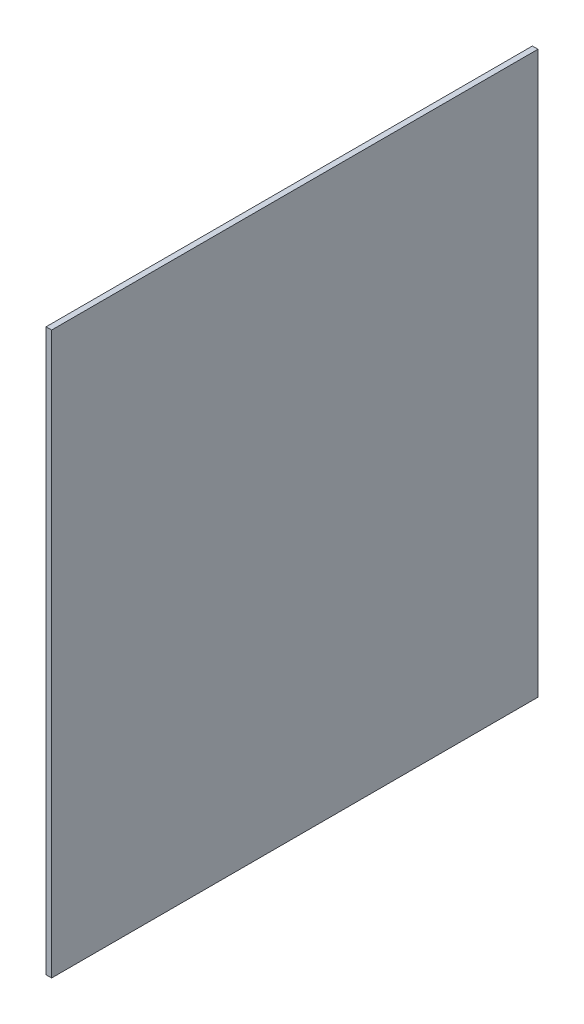
ISO-10303-21;
HEADER;
FILE_DESCRIPTION(('STEP AP214'),'2;1');
FILE_NAME('part.step','',(''),(''),'','','');
FILE_SCHEMA(('AUTOMOTIVE_DESIGN { 1 0 10303 214 1 1 1 1 }'));
ENDSEC;
DATA;
#1=APPLICATION_CONTEXT('core data for automotive mechanical design processes');
#2=APPLICATION_PROTOCOL_DEFINITION('international standard','automotive_design',2000,#1);
#3=PRODUCT_CONTEXT('',#1,'mechanical');
#4=PRODUCT('Part','Part','',(#3));
#5=PRODUCT_RELATED_PRODUCT_CATEGORY('part','',(#4));
#6=PRODUCT_DEFINITION_FORMATION('','',#4);
#7=PRODUCT_DEFINITION_CONTEXT('part definition',#1,'design');
#8=PRODUCT_DEFINITION('design','',#6,#7);
#9=PRODUCT_DEFINITION_SHAPE('','',#8);
#10=(LENGTH_UNIT() NAMED_UNIT(*) SI_UNIT(.MILLI.,.METRE.));
#11=(NAMED_UNIT(*) PLANE_ANGLE_UNIT() SI_UNIT($,.RADIAN.));
#12=(NAMED_UNIT(*) SI_UNIT($,.STERADIAN.) SOLID_ANGLE_UNIT());
#13=UNCERTAINTY_MEASURE_WITH_UNIT(LENGTH_MEASURE(1.E-05),#10,'distance_accuracy_value','');
#14=(GEOMETRIC_REPRESENTATION_CONTEXT(3) GLOBAL_UNCERTAINTY_ASSIGNED_CONTEXT((#13)) GLOBAL_UNIT_ASSIGNED_CONTEXT((#10,
#11,#12)) REPRESENTATION_CONTEXT('',''));
#15=CARTESIAN_POINT('',(0.,0.,0.));
#16=DIRECTION('',(0.,0.,1.));
#17=DIRECTION('',(1.,0.,0.));
#18=AXIS2_PLACEMENT_3D('',#15,#16,#17);
#19=CARTESIAN_POINT('',(3.,16.0645161290323,248.145161290323));
#20=DIRECTION('',(0.,0.,-1.));
#21=DIRECTION('',(0.,1.,0.));
#22=AXIS2_PLACEMENT_3D('',#19,#20,#21);
#23=PLANE('',#22);
#24=DIRECTION('',(0.,-1.,0.));
#25=VECTOR('',#24,1.);
#26=CARTESIAN_POINT('',(0.,16.0645161290323,248.145161290323));
#27=LINE('',#26,#25);
#28=CARTESIAN_POINT('',(0.,16.0645161290323,248.145161290323));
#29=VERTEX_POINT('',#28);
#30=CARTESIAN_POINT('',(0.,-283.935483870968,248.145161290323));
#31=VERTEX_POINT('',#30);
#32=EDGE_CURVE('E105',#29,#31,#27,.T.);
#33=ORIENTED_EDGE('',*,*,#32,.T.);
#34=DIRECTION('',(-1.,0.,0.));
#35=VECTOR('',#34,1.);
#36=CARTESIAN_POINT('',(3.,-283.935483870968,248.145161290323));
#37=LINE('',#36,#35);
#38=CARTESIAN_POINT('',(3.,-283.935483870968,248.145161290323));
#39=VERTEX_POINT('',#38);
#40=EDGE_CURVE('E11',#39,#31,#37,.T.);
#41=ORIENTED_EDGE('',*,*,#40,.F.);
#42=DIRECTION('',(0.,-1.,0.));
#43=VECTOR('',#42,1.);
#44=CARTESIAN_POINT('',(3.,16.0645161290323,248.145161290323));
#45=LINE('',#44,#43);
#46=CARTESIAN_POINT('',(3.,16.0645161290323,248.145161290323));
#47=VERTEX_POINT('',#46);
#48=EDGE_CURVE('E89',#47,#39,#45,.T.);
#49=ORIENTED_EDGE('',*,*,#48,.F.);
#50=DIRECTION('',(-1.,0.,0.));
#51=VECTOR('',#50,1.);
#52=CARTESIAN_POINT('',(3.,16.0645161290323,248.145161290323));
#53=LINE('',#52,#51);
#54=EDGE_CURVE('E98',#47,#29,#53,.T.);
#55=ORIENTED_EDGE('',*,*,#54,.T.);
#56=EDGE_LOOP('',(#33,#41,#49,#55));
#57=FACE_BOUND('',#56,.T.);
#58=ADVANCED_FACE('F39',(#57),#23,.F.);
#59=CARTESIAN_POINT('',(3.,-283.935483870968,248.145161290323));
#60=DIRECTION('',(0.,1.,0.));
#61=DIRECTION('',(0.,0.,1.));
#62=AXIS2_PLACEMENT_3D('',#59,#60,#61);
#63=PLANE('',#62);
#64=DIRECTION('',(0.,0.,-1.));
#65=VECTOR('',#64,1.);
#66=CARTESIAN_POINT('',(0.,-283.935483870968,248.145161290323));
#67=LINE('',#66,#65);
#68=CARTESIAN_POINT('',(0.,-283.935483870968,-11.8548387096775));
#69=VERTEX_POINT('',#68);
#70=EDGE_CURVE('E94',#31,#69,#67,.T.);
#71=ORIENTED_EDGE('',*,*,#70,.T.);
#72=DIRECTION('',(-1.,0.,0.));
#73=VECTOR('',#72,1.);
#74=CARTESIAN_POINT('',(3.,-283.935483870968,-11.8548387096775));
#75=LINE('',#74,#73);
#76=CARTESIAN_POINT('',(3.,-283.935483870968,-11.8548387096775));
#77=VERTEX_POINT('',#76);
#78=EDGE_CURVE('E50',#77,#69,#75,.T.);
#79=ORIENTED_EDGE('',*,*,#78,.F.);
#80=DIRECTION('',(0.,0.,-1.));
#81=VECTOR('',#80,1.);
#82=CARTESIAN_POINT('',(3.,-283.935483870968,248.145161290323));
#83=LINE('',#82,#81);
#84=EDGE_CURVE('E83',#39,#77,#83,.T.);
#85=ORIENTED_EDGE('',*,*,#84,.F.);
#86=ORIENTED_EDGE('',*,*,#40,.T.);
#87=EDGE_LOOP('',(#71,#79,#85,#86));
#88=FACE_BOUND('',#87,.T.);
#89=ADVANCED_FACE('F91',(#88),#63,.F.);
#90=CARTESIAN_POINT('',(3.,16.0645161290323,-11.8548387096774));
#91=DIRECTION('',(0.,0.,1.));
#92=DIRECTION('',(0.,-1.,0.));
#93=AXIS2_PLACEMENT_3D('',#90,#91,#92);
#94=PLANE('',#93);
#95=DIRECTION('',(0.,1.,0.));
#96=VECTOR('',#95,1.);
#97=CARTESIAN_POINT('',(0.,16.0645161290323,-11.8548387096774));
#98=LINE('',#97,#96);
#99=CARTESIAN_POINT('',(0.,16.0645161290323,-11.8548387096774));
#100=VERTEX_POINT('',#99);
#101=EDGE_CURVE('E75',#69,#100,#98,.T.);
#102=ORIENTED_EDGE('',*,*,#101,.T.);
#103=DIRECTION('',(-1.,0.,0.));
#104=VECTOR('',#103,1.);
#105=CARTESIAN_POINT('',(3.,16.0645161290323,-11.8548387096774));
#106=LINE('',#105,#104);
#107=CARTESIAN_POINT('',(3.,16.0645161290323,-11.8548387096774));
#108=VERTEX_POINT('',#107);
#109=EDGE_CURVE('E92',#108,#100,#106,.T.);
#110=ORIENTED_EDGE('',*,*,#109,.F.);
#111=DIRECTION('',(0.,1.,0.));
#112=VECTOR('',#111,1.);
#113=CARTESIAN_POINT('',(3.,16.0645161290323,-11.8548387096774));
#114=LINE('',#113,#112);
#115=EDGE_CURVE('E86',#77,#108,#114,.T.);
#116=ORIENTED_EDGE('',*,*,#115,.F.);
#117=ORIENTED_EDGE('',*,*,#78,.T.);
#118=EDGE_LOOP('',(#102,#110,#116,#117));
#119=FACE_BOUND('',#118,.T.);
#120=ADVANCED_FACE('F96',(#119),#94,.F.);
#121=CARTESIAN_POINT('',(3.,16.0645161290323,248.145161290323));
#122=DIRECTION('',(0.,-1.,0.));
#123=DIRECTION('',(0.,0.,-1.));
#124=AXIS2_PLACEMENT_3D('',#121,#122,#123);
#125=PLANE('',#124);
#126=DIRECTION('',(0.,0.,1.));
#127=VECTOR('',#126,1.);
#128=CARTESIAN_POINT('',(0.,16.0645161290323,248.145161290323));
#129=LINE('',#128,#127);
#130=EDGE_CURVE('E79',#100,#29,#129,.T.);
#131=ORIENTED_EDGE('',*,*,#130,.T.);
#132=ORIENTED_EDGE('',*,*,#54,.F.);
#133=DIRECTION('',(0.,0.,1.));
#134=VECTOR('',#133,1.);
#135=CARTESIAN_POINT('',(3.,16.0645161290323,248.145161290323));
#136=LINE('',#135,#134);
#137=EDGE_CURVE('E54',#108,#47,#136,.T.);
#138=ORIENTED_EDGE('',*,*,#137,.F.);
#139=ORIENTED_EDGE('',*,*,#109,.T.);
#140=EDGE_LOOP('',(#131,#132,#138,#139));
#141=FACE_BOUND('',#140,.T.);
#142=ADVANCED_FACE('F108',(#141),#125,.F.);
#143=CARTESIAN_POINT('',(3.,0.,0.));
#144=DIRECTION('',(1.,0.,0.));
#145=DIRECTION('',(0.,0.,-1.));
#146=AXIS2_PLACEMENT_3D('',#143,#144,#145);
#147=PLANE('',#146);
#148=ORIENTED_EDGE('',*,*,#48,.T.);
#149=ORIENTED_EDGE('',*,*,#84,.T.);
#150=ORIENTED_EDGE('',*,*,#115,.T.);
#151=ORIENTED_EDGE('',*,*,#137,.T.);
#152=EDGE_LOOP('',(#148,#149,#150,#151));
#153=FACE_BOUND('',#152,.T.);
#154=ADVANCED_FACE('F88',(#153),#147,.T.);
#155=CARTESIAN_POINT('',(0.,0.,0.));
#156=DIRECTION('',(1.,0.,0.));
#157=DIRECTION('',(0.,0.,-1.));
#158=AXIS2_PLACEMENT_3D('',#155,#156,#157);
#159=PLANE('',#158);
#160=ORIENTED_EDGE('',*,*,#32,.F.);
#161=ORIENTED_EDGE('',*,*,#130,.F.);
#162=ORIENTED_EDGE('',*,*,#101,.F.);
#163=ORIENTED_EDGE('',*,*,#70,.F.);
#164=EDGE_LOOP('',(#160,#161,#162,#163));
#165=FACE_BOUND('',#164,.T.);
#166=ADVANCED_FACE('F115',(#165),#159,.F.);
#167=CLOSED_SHELL('',(#58,#89,#120,#142,#154,#166));
#168=MANIFOLD_SOLID_BREP('B2',#167);
#169=ADVANCED_BREP_SHAPE_REPRESENTATION('',(#18,#168),#14);
#170=SHAPE_DEFINITION_REPRESENTATION(#9,#169);
ENDSEC;
END-ISO-10303-21;
